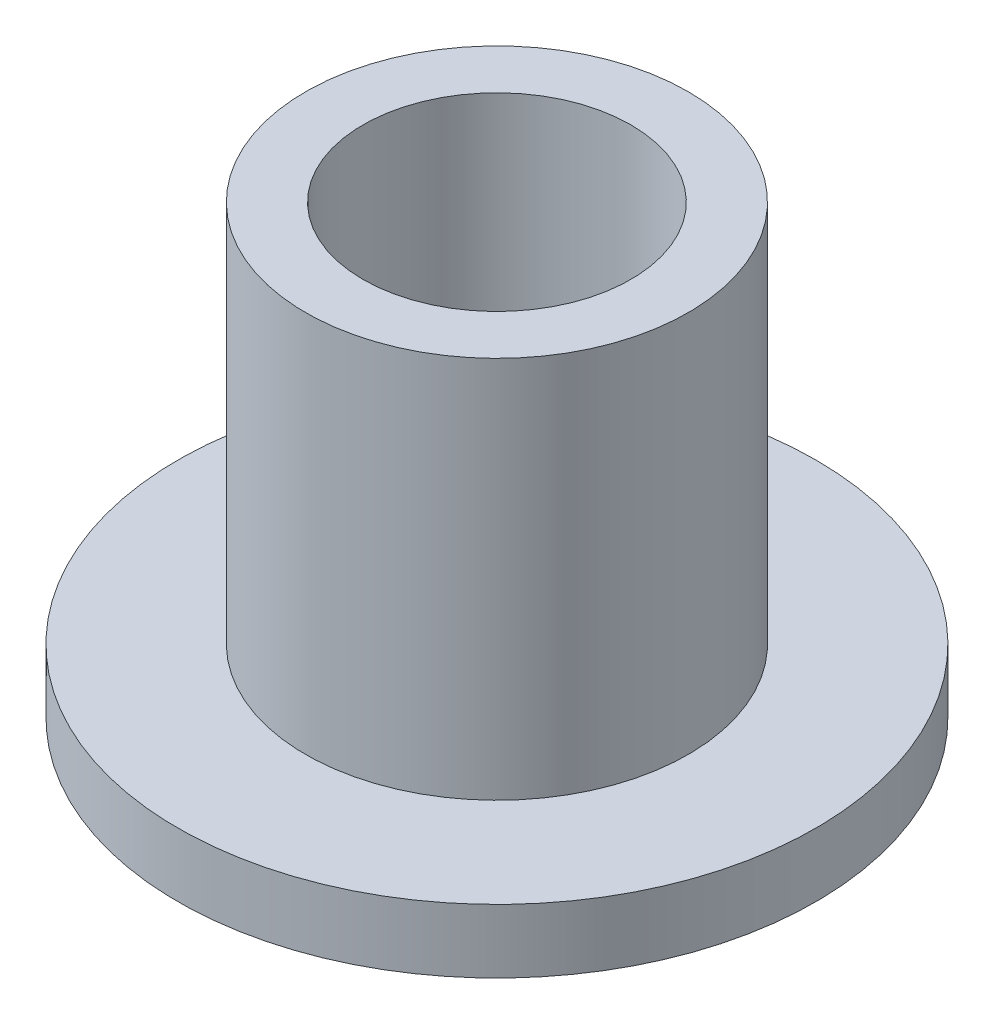
ISO-10303-21;
HEADER;
FILE_DESCRIPTION(('STEP AP214'),'2;1');
FILE_NAME('part.step','',(''),(''),'','','');
FILE_SCHEMA(('AUTOMOTIVE_DESIGN { 1 0 10303 214 1 1 1 1 }'));
ENDSEC;
DATA;
#1=APPLICATION_CONTEXT('core data for automotive mechanical design processes');
#2=APPLICATION_PROTOCOL_DEFINITION('international standard','automotive_design',2000,#1);
#3=PRODUCT_CONTEXT('',#1,'mechanical');
#4=PRODUCT('Part','Part','',(#3));
#5=PRODUCT_RELATED_PRODUCT_CATEGORY('part','',(#4));
#6=PRODUCT_DEFINITION_FORMATION('','',#4);
#7=PRODUCT_DEFINITION_CONTEXT('part definition',#1,'design');
#8=PRODUCT_DEFINITION('design','',#6,#7);
#9=PRODUCT_DEFINITION_SHAPE('','',#8);
#10=(LENGTH_UNIT() NAMED_UNIT(*) SI_UNIT(.MILLI.,.METRE.));
#11=(NAMED_UNIT(*) PLANE_ANGLE_UNIT() SI_UNIT($,.RADIAN.));
#12=(NAMED_UNIT(*) SI_UNIT($,.STERADIAN.) SOLID_ANGLE_UNIT());
#13=UNCERTAINTY_MEASURE_WITH_UNIT(LENGTH_MEASURE(1.E-05),#10,'distance_accuracy_value','');
#14=(GEOMETRIC_REPRESENTATION_CONTEXT(3) GLOBAL_UNCERTAINTY_ASSIGNED_CONTEXT((#13)) GLOBAL_UNIT_ASSIGNED_CONTEXT((#10,
#11,#12)) REPRESENTATION_CONTEXT('',''));
#15=CARTESIAN_POINT('',(0.,0.,0.));
#16=DIRECTION('',(0.,0.,1.));
#17=DIRECTION('',(1.,0.,0.));
#18=AXIS2_PLACEMENT_3D('',#15,#16,#17);
#19=CARTESIAN_POINT('',(0.,0.,0.));
#20=DIRECTION('',(0.,1.,0.));
#21=DIRECTION('',(0.,0.,1.));
#22=AXIS2_PLACEMENT_3D('',#19,#20,#21);
#23=PLANE('',#22);
#24=CARTESIAN_POINT('',(0.,0.,0.));
#25=DIRECTION('',(0.,1.,0.));
#26=DIRECTION('',(0.,0.,1.));
#27=AXIS2_PLACEMENT_3D('',#24,#25,#26);
#28=CIRCLE('',#27,2.1);
#29=CARTESIAN_POINT('',(0.,0.,2.1));
#30=VERTEX_POINT('',#29);
#31=EDGE_CURVE('E49',#30,#30,#28,.T.);
#32=ORIENTED_EDGE('',*,*,#31,.T.);
#33=EDGE_LOOP('',(#32));
#34=FACE_BOUND('',#33,.T.);
#35=CARTESIAN_POINT('',(0.,0.,0.));
#36=DIRECTION('',(0.,-1.,0.));
#37=DIRECTION('',(0.,0.,-1.));
#38=AXIS2_PLACEMENT_3D('',#35,#36,#37);
#39=CIRCLE('',#38,5.);
#40=CARTESIAN_POINT('',(0.,0.,-5.));
#41=VERTEX_POINT('',#40);
#42=EDGE_CURVE('E10',#41,#41,#39,.T.);
#43=ORIENTED_EDGE('',*,*,#42,.T.);
#44=EDGE_LOOP('',(#43));
#45=FACE_BOUND('',#44,.T.);
#46=ADVANCED_FACE('F30',(#34,#45),#23,.F.);
#47=CARTESIAN_POINT('',(0.,0.,0.));
#48=DIRECTION('',(0.,-1.,0.));
#49=DIRECTION('',(0.,0.,-1.));
#50=AXIS2_PLACEMENT_3D('',#47,#48,#49);
#51=CYLINDRICAL_SURFACE('',#50,5.);
#52=ORIENTED_EDGE('',*,*,#42,.F.);
#53=EDGE_LOOP('',(#52));
#54=FACE_BOUND('',#53,.T.);
#55=CARTESIAN_POINT('',(0.,0.999999999999999,0.));
#56=DIRECTION('',(0.,-1.,0.));
#57=DIRECTION('',(0.,0.,-1.));
#58=AXIS2_PLACEMENT_3D('',#55,#56,#57);
#59=CIRCLE('',#58,5.);
#60=CARTESIAN_POINT('',(0.,0.999999999999999,-5.));
#61=VERTEX_POINT('',#60);
#62=EDGE_CURVE('E36',#61,#61,#59,.T.);
#63=ORIENTED_EDGE('',*,*,#62,.T.);
#64=EDGE_LOOP('',(#63));
#65=FACE_BOUND('',#64,.T.);
#66=ADVANCED_FACE('F72',(#54,#65),#51,.T.);
#67=CARTESIAN_POINT('',(-5.,0.999999999999999,0.));
#68=DIRECTION('',(0.,-1.,0.));
#69=DIRECTION('',(0.,0.,-1.));
#70=AXIS2_PLACEMENT_3D('',#67,#68,#69);
#71=PLANE('',#70);
#72=ORIENTED_EDGE('',*,*,#62,.F.);
#73=EDGE_LOOP('',(#72));
#74=FACE_BOUND('',#73,.T.);
#75=CARTESIAN_POINT('',(0.,0.999999999999999,0.));
#76=DIRECTION('',(0.,-1.,0.));
#77=DIRECTION('',(0.,0.,-1.));
#78=AXIS2_PLACEMENT_3D('',#75,#76,#77);
#79=CIRCLE('',#78,3.);
#80=CARTESIAN_POINT('',(0.,0.999999999999999,-3.));
#81=VERTEX_POINT('',#80);
#82=EDGE_CURVE('E40',#81,#81,#79,.T.);
#83=ORIENTED_EDGE('',*,*,#82,.T.);
#84=EDGE_LOOP('',(#83));
#85=FACE_BOUND('',#84,.T.);
#86=ADVANCED_FACE('F66',(#74,#85),#71,.F.);
#87=CARTESIAN_POINT('',(0.,0.,0.));
#88=DIRECTION('',(0.,-1.,0.));
#89=DIRECTION('',(0.,0.,-1.));
#90=AXIS2_PLACEMENT_3D('',#87,#88,#89);
#91=CYLINDRICAL_SURFACE('',#90,3.);
#92=ORIENTED_EDGE('',*,*,#82,.F.);
#93=EDGE_LOOP('',(#92));
#94=FACE_BOUND('',#93,.T.);
#95=CARTESIAN_POINT('',(0.,7.,0.));
#96=DIRECTION('',(0.,-1.,0.));
#97=DIRECTION('',(0.,0.,-1.));
#98=AXIS2_PLACEMENT_3D('',#95,#96,#97);
#99=CIRCLE('',#98,3.);
#100=CARTESIAN_POINT('',(0.,7.,-3.));
#101=VERTEX_POINT('',#100);
#102=EDGE_CURVE('E44',#101,#101,#99,.T.);
#103=ORIENTED_EDGE('',*,*,#102,.T.);
#104=EDGE_LOOP('',(#103));
#105=FACE_BOUND('',#104,.T.);
#106=ADVANCED_FACE('F61',(#94,#105),#91,.T.);
#107=CARTESIAN_POINT('',(-3.,7.,0.));
#108=DIRECTION('',(0.,-1.,0.));
#109=DIRECTION('',(0.,0.,-1.));
#110=AXIS2_PLACEMENT_3D('',#107,#108,#109);
#111=PLANE('',#110);
#112=CARTESIAN_POINT('',(0.,7.,0.));
#113=DIRECTION('',(0.,1.,0.));
#114=DIRECTION('',(0.,0.,1.));
#115=AXIS2_PLACEMENT_3D('',#112,#113,#114);
#116=CIRCLE('',#115,2.1);
#117=CARTESIAN_POINT('',(0.,7.,2.1));
#118=VERTEX_POINT('',#117);
#119=EDGE_CURVE('E52',#118,#118,#116,.T.);
#120=ORIENTED_EDGE('',*,*,#119,.F.);
#121=EDGE_LOOP('',(#120));
#122=FACE_BOUND('',#121,.T.);
#123=ORIENTED_EDGE('',*,*,#102,.F.);
#124=EDGE_LOOP('',(#123));
#125=FACE_BOUND('',#124,.T.);
#126=ADVANCED_FACE('F58',(#122,#125),#111,.F.);
#127=CARTESIAN_POINT('',(0.,7.,0.));
#128=DIRECTION('',(0.,1.,0.));
#129=DIRECTION('',(0.,0.,1.));
#130=AXIS2_PLACEMENT_3D('',#127,#128,#129);
#131=CYLINDRICAL_SURFACE('',#130,2.1);
#132=ORIENTED_EDGE('',*,*,#31,.F.);
#133=EDGE_LOOP('',(#132));
#134=FACE_BOUND('',#133,.T.);
#135=ORIENTED_EDGE('',*,*,#119,.T.);
#136=EDGE_LOOP('',(#135));
#137=FACE_BOUND('',#136,.T.);
#138=ADVANCED_FACE('F56',(#134,#137),#131,.F.);
#139=CLOSED_SHELL('',(#46,#66,#86,#106,#126,#138));
#140=MANIFOLD_SOLID_BREP('B2',#139);
#141=ADVANCED_BREP_SHAPE_REPRESENTATION('',(#18,#140),#14);
#142=SHAPE_DEFINITION_REPRESENTATION(#9,#141);
ENDSEC;
END-ISO-10303-21;
